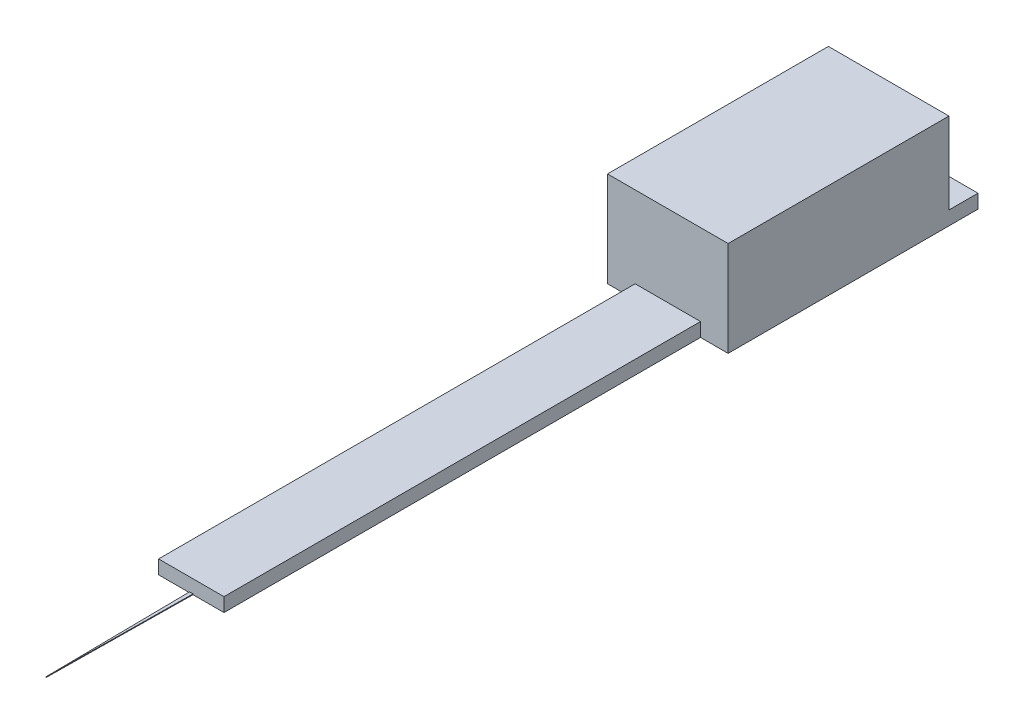
ISO-10303-21;
HEADER;
FILE_DESCRIPTION(('STEP AP214'),'2;1');
FILE_NAME('part.step','',(''),(''),'','','');
FILE_SCHEMA(('AUTOMOTIVE_DESIGN { 1 0 10303 214 1 1 1 1 }'));
ENDSEC;
DATA;
#1=APPLICATION_CONTEXT('core data for automotive mechanical design processes');
#2=APPLICATION_PROTOCOL_DEFINITION('international standard','automotive_design',2000,#1);
#3=PRODUCT_CONTEXT('',#1,'mechanical');
#4=PRODUCT('Part','Part','',(#3));
#5=PRODUCT_RELATED_PRODUCT_CATEGORY('part','',(#4));
#6=PRODUCT_DEFINITION_FORMATION('','',#4);
#7=PRODUCT_DEFINITION_CONTEXT('part definition',#1,'design');
#8=PRODUCT_DEFINITION('design','',#6,#7);
#9=PRODUCT_DEFINITION_SHAPE('','',#8);
#10=(LENGTH_UNIT() NAMED_UNIT(*) SI_UNIT(.MILLI.,.METRE.));
#11=(NAMED_UNIT(*) PLANE_ANGLE_UNIT() SI_UNIT($,.RADIAN.));
#12=(NAMED_UNIT(*) SI_UNIT($,.STERADIAN.) SOLID_ANGLE_UNIT());
#13=UNCERTAINTY_MEASURE_WITH_UNIT(LENGTH_MEASURE(1.E-05),#10,'distance_accuracy_value','');
#14=(GEOMETRIC_REPRESENTATION_CONTEXT(3) GLOBAL_UNCERTAINTY_ASSIGNED_CONTEXT((#13)) GLOBAL_UNIT_ASSIGNED_CONTEXT((#10,
#11,#12)) REPRESENTATION_CONTEXT('',''));
#15=CARTESIAN_POINT('',(0.,0.,0.));
#16=DIRECTION('',(0.,0.,1.));
#17=DIRECTION('',(1.,0.,0.));
#18=AXIS2_PLACEMENT_3D('',#15,#16,#17);
#19=CARTESIAN_POINT('',(-4.15,0.95,-60.));
#20=DIRECTION('',(0.,-1.,0.));
#21=DIRECTION('',(0.,0.,-1.));
#22=AXIS2_PLACEMENT_3D('',#19,#20,#21);
#23=PLANE('',#22);
#24=DIRECTION('',(1.,0.,0.));
#25=VECTOR('',#24,1.);
#26=CARTESIAN_POINT('',(4.15,0.95,-42.8));
#27=LINE('',#26,#25);
#28=CARTESIAN_POINT('',(-2.25,0.95,-42.8));
#29=VERTEX_POINT('',#28);
#30=CARTESIAN_POINT('',(2.25,0.95,-42.8));
#31=VERTEX_POINT('',#30);
#32=EDGE_CURVE('E11',#29,#31,#27,.T.);
#33=ORIENTED_EDGE('',*,*,#32,.F.);
#34=DIRECTION('',(0.,0.,1.));
#35=VECTOR('',#34,1.);
#36=CARTESIAN_POINT('',(-2.25,0.95,-10.));
#37=LINE('',#36,#35);
#38=CARTESIAN_POINT('',(-2.25,0.95,-10.));
#39=VERTEX_POINT('',#38);
#40=EDGE_CURVE('E163',#29,#39,#37,.T.);
#41=ORIENTED_EDGE('',*,*,#40,.T.);
#42=DIRECTION('',(1.,0.,0.));
#43=VECTOR('',#42,1.);
#44=CARTESIAN_POINT('',(2.25,0.95,-10.));
#45=LINE('',#44,#43);
#46=CARTESIAN_POINT('',(2.25,0.95,-10.));
#47=VERTEX_POINT('',#46);
#48=EDGE_CURVE('E185',#39,#47,#45,.T.);
#49=ORIENTED_EDGE('',*,*,#48,.T.);
#50=DIRECTION('',(0.,0.,-1.));
#51=VECTOR('',#50,1.);
#52=CARTESIAN_POINT('',(2.25,0.95,-42.8));
#53=LINE('',#52,#51);
#54=EDGE_CURVE('E252',#47,#31,#53,.T.);
#55=ORIENTED_EDGE('',*,*,#54,.T.);
#56=EDGE_LOOP('',(#33,#41,#49,#55));
#57=FACE_BOUND('',#56,.T.);
#58=ADVANCED_FACE('F31',(#57),#23,.F.);
#59=DIRECTION('',(-1.,0.,0.));
#60=VECTOR('',#59,1.);
#61=CARTESIAN_POINT('',(4.15,0.95,-58.));
#62=LINE('',#61,#60);
#63=CARTESIAN_POINT('',(4.15,0.95,-58.));
#64=VERTEX_POINT('',#63);
#65=CARTESIAN_POINT('',(-4.15,0.95,-58.));
#66=VERTEX_POINT('',#65);
#67=EDGE_CURVE('E48',#64,#66,#62,.T.);
#68=ORIENTED_EDGE('',*,*,#67,.F.);
#69=DIRECTION('',(0.,0.,-1.));
#70=VECTOR('',#69,1.);
#71=CARTESIAN_POINT('',(4.15,0.95,-60.));
#72=LINE('',#71,#70);
#73=CARTESIAN_POINT('',(4.15,0.95,-60.));
#74=VERTEX_POINT('',#73);
#75=EDGE_CURVE('E160',#64,#74,#72,.T.);
#76=ORIENTED_EDGE('',*,*,#75,.T.);
#77=DIRECTION('',(-1.,0.,0.));
#78=VECTOR('',#77,1.);
#79=CARTESIAN_POINT('',(-4.15,0.95,-60.));
#80=LINE('',#79,#78);
#81=CARTESIAN_POINT('',(-4.15,0.95,-60.));
#82=VERTEX_POINT('',#81);
#83=EDGE_CURVE('E247',#74,#82,#80,.T.);
#84=ORIENTED_EDGE('',*,*,#83,.T.);
#85=DIRECTION('',(0.,0.,1.));
#86=VECTOR('',#85,1.);
#87=CARTESIAN_POINT('',(-4.15,0.95,-42.8));
#88=LINE('',#87,#86);
#89=EDGE_CURVE('E161',#82,#66,#88,.T.);
#90=ORIENTED_EDGE('',*,*,#89,.T.);
#91=EDGE_LOOP('',(#68,#76,#84,#90));
#92=FACE_BOUND('',#91,.T.);
#93=ADVANCED_FACE('F291',(#92),#23,.F.);
#94=CARTESIAN_POINT('',(0.,0.05,0.));
#95=DIRECTION('',(0.999928007775067,0.,-0.0119991360933008));
#96=DIRECTION('',(-0.0119991360933008,0.,-0.999928007775067));
#97=AXIS2_PLACEMENT_3D('',#94,#95,#96);
#98=PLANE('',#97);
#99=DIRECTION('',(0.0119991360933008,0.,0.999928007775067));
#100=VECTOR('',#99,1.);
#101=CARTESIAN_POINT('',(0.,0.,0.));
#102=LINE('',#101,#100);
#103=CARTESIAN_POINT('',(-0.12,0.,-10.));
#104=VERTEX_POINT('',#103);
#105=CARTESIAN_POINT('',(0.,0.,0.));
#106=VERTEX_POINT('',#105);
#107=EDGE_CURVE('E244',#104,#106,#102,.T.);
#108=ORIENTED_EDGE('',*,*,#107,.T.);
#109=DIRECTION('',(0.,-1.,0.));
#110=VECTOR('',#109,1.);
#111=CARTESIAN_POINT('',(0.,0.05,0.));
#112=LINE('',#111,#110);
#113=CARTESIAN_POINT('',(0.,0.05,0.));
#114=VERTEX_POINT('',#113);
#115=EDGE_CURVE('E201',#114,#106,#112,.T.);
#116=ORIENTED_EDGE('',*,*,#115,.F.);
#117=DIRECTION('',(0.0119991360933008,0.,0.999928007775067));
#118=VECTOR('',#117,1.);
#119=CARTESIAN_POINT('',(0.,0.05,0.));
#120=LINE('',#119,#118);
#121=CARTESIAN_POINT('',(-0.12,0.05,-10.));
#122=VERTEX_POINT('',#121);
#123=EDGE_CURVE('E189',#122,#114,#120,.T.);
#124=ORIENTED_EDGE('',*,*,#123,.F.);
#125=DIRECTION('',(0.,-1.,0.));
#126=VECTOR('',#125,1.);
#127=CARTESIAN_POINT('',(-0.12,0.05,-10.));
#128=LINE('',#127,#126);
#129=EDGE_CURVE('E193',#122,#104,#128,.T.);
#130=ORIENTED_EDGE('',*,*,#129,.T.);
#131=EDGE_LOOP('',(#108,#116,#124,#130));
#132=FACE_BOUND('',#131,.T.);
#133=ADVANCED_FACE('F33',(#132),#98,.F.);
#134=CARTESIAN_POINT('',(0.,0.05,0.));
#135=DIRECTION('',(-0.999928007775067,0.,-0.0119991360933008));
#136=DIRECTION('',(-0.0119991360933008,0.,0.999928007775067));
#137=AXIS2_PLACEMENT_3D('',#134,#135,#136);
#138=PLANE('',#137);
#139=DIRECTION('',(0.0119991360933008,0.,-0.999928007775067));
#140=VECTOR('',#139,1.);
#141=CARTESIAN_POINT('',(0.,0.,0.));
#142=LINE('',#141,#140);
#143=CARTESIAN_POINT('',(0.12,0.,-10.));
#144=VERTEX_POINT('',#143);
#145=EDGE_CURVE('E242',#106,#144,#142,.T.);
#146=ORIENTED_EDGE('',*,*,#145,.T.);
#147=DIRECTION('',(0.,-1.,0.));
#148=VECTOR('',#147,1.);
#149=CARTESIAN_POINT('',(0.12,0.05,-10.));
#150=LINE('',#149,#148);
#151=CARTESIAN_POINT('',(0.12,0.05,-10.));
#152=VERTEX_POINT('',#151);
#153=EDGE_CURVE('E198',#152,#144,#150,.T.);
#154=ORIENTED_EDGE('',*,*,#153,.F.);
#155=DIRECTION('',(0.0119991360933008,0.,-0.999928007775067));
#156=VECTOR('',#155,1.);
#157=CARTESIAN_POINT('',(0.,0.05,0.));
#158=LINE('',#157,#156);
#159=EDGE_CURVE('E103',#114,#152,#158,.T.);
#160=ORIENTED_EDGE('',*,*,#159,.F.);
#161=ORIENTED_EDGE('',*,*,#115,.T.);
#162=EDGE_LOOP('',(#146,#154,#160,#161));
#163=FACE_BOUND('',#162,.T.);
#164=ADVANCED_FACE('F299',(#163),#138,.F.);
#165=CARTESIAN_POINT('',(2.25,0.05,-10.));
#166=DIRECTION('',(-1.,0.,0.));
#167=DIRECTION('',(0.,0.,1.));
#168=AXIS2_PLACEMENT_3D('',#165,#166,#167);
#169=PLANE('',#168);
#170=DIRECTION('',(0.,0.,-1.));
#171=VECTOR('',#170,1.);
#172=CARTESIAN_POINT('',(2.25,0.,-10.));
#173=LINE('',#172,#171);
#174=CARTESIAN_POINT('',(2.25,0.,-10.));
#175=VERTEX_POINT('',#174);
#176=CARTESIAN_POINT('',(2.25,0.,-42.8));
#177=VERTEX_POINT('',#176);
#178=EDGE_CURVE('E238',#175,#177,#173,.T.);
#179=ORIENTED_EDGE('',*,*,#178,.T.);
#180=DIRECTION('',(0.,-1.,0.));
#181=VECTOR('',#180,1.);
#182=CARTESIAN_POINT('',(2.25,0.05,-42.8));
#183=LINE('',#182,#181);
#184=EDGE_CURVE('E172',#31,#177,#183,.T.);
#185=ORIENTED_EDGE('',*,*,#184,.F.);
#186=ORIENTED_EDGE('',*,*,#54,.F.);
#187=DIRECTION('',(0.,-1.,0.));
#188=VECTOR('',#187,1.);
#189=CARTESIAN_POINT('',(2.25,0.05,-10.));
#190=LINE('',#189,#188);
#191=EDGE_CURVE('E202',#47,#175,#190,.T.);
#192=ORIENTED_EDGE('',*,*,#191,.T.);
#193=EDGE_LOOP('',(#179,#185,#186,#192));
#194=FACE_BOUND('',#193,.T.);
#195=ADVANCED_FACE('F274',(#194),#169,.F.);
#196=CARTESIAN_POINT('',(4.15,0.05,-42.8));
#197=DIRECTION('',(-1.,0.,0.));
#198=DIRECTION('',(0.,0.,1.));
#199=AXIS2_PLACEMENT_3D('',#196,#197,#198);
#200=PLANE('',#199);
#201=DIRECTION('',(0.,0.,-1.));
#202=VECTOR('',#201,1.);
#203=CARTESIAN_POINT('',(4.15,0.,-42.8));
#204=LINE('',#203,#202);
#205=CARTESIAN_POINT('',(4.15,0.,-42.8));
#206=VERTEX_POINT('',#205);
#207=CARTESIAN_POINT('',(4.15,0.,-60.));
#208=VERTEX_POINT('',#207);
#209=EDGE_CURVE('E234',#206,#208,#204,.T.);
#210=ORIENTED_EDGE('',*,*,#209,.T.);
#211=DIRECTION('',(0.,-1.,0.));
#212=VECTOR('',#211,1.);
#213=CARTESIAN_POINT('',(4.15,0.05,-60.));
#214=LINE('',#213,#212);
#215=EDGE_CURVE('E214',#74,#208,#214,.T.);
#216=ORIENTED_EDGE('',*,*,#215,.F.);
#217=ORIENTED_EDGE('',*,*,#75,.F.);
#218=DIRECTION('',(0.,-1.,0.));
#219=VECTOR('',#218,1.);
#220=CARTESIAN_POINT('',(4.15,6.55,-58.));
#221=LINE('',#220,#219);
#222=CARTESIAN_POINT('',(4.15,6.55,-58.));
#223=VERTEX_POINT('',#222);
#224=EDGE_CURVE('E141',#223,#64,#221,.T.);
#225=ORIENTED_EDGE('',*,*,#224,.F.);
#226=DIRECTION('',(0.,0.,-1.));
#227=VECTOR('',#226,1.);
#228=CARTESIAN_POINT('',(4.15,6.55,-58.));
#229=LINE('',#228,#227);
#230=CARTESIAN_POINT('',(4.15,6.55,-42.8));
#231=VERTEX_POINT('',#230);
#232=EDGE_CURVE('E148',#231,#223,#229,.T.);
#233=ORIENTED_EDGE('',*,*,#232,.F.);
#234=DIRECTION('',(0.,-1.,0.));
#235=VECTOR('',#234,1.);
#236=CARTESIAN_POINT('',(4.15,0.05,-42.8));
#237=LINE('',#236,#235);
#238=EDGE_CURVE('E212',#231,#206,#237,.T.);
#239=ORIENTED_EDGE('',*,*,#238,.T.);
#240=EDGE_LOOP('',(#210,#216,#217,#225,#233,#239));
#241=FACE_BOUND('',#240,.T.);
#242=ADVANCED_FACE('F158',(#241),#200,.F.);
#243=CARTESIAN_POINT('',(4.15,0.05,-60.));
#244=DIRECTION('',(0.,0.,1.));
#245=DIRECTION('',(1.,0.,0.));
#246=AXIS2_PLACEMENT_3D('',#243,#244,#245);
#247=PLANE('',#246);
#248=DIRECTION('',(-1.,0.,0.));
#249=VECTOR('',#248,1.);
#250=CARTESIAN_POINT('',(4.15,0.,-60.));
#251=LINE('',#250,#249);
#252=CARTESIAN_POINT('',(-4.15,0.,-60.));
#253=VERTEX_POINT('',#252);
#254=EDGE_CURVE('E232',#208,#253,#251,.T.);
#255=ORIENTED_EDGE('',*,*,#254,.T.);
#256=DIRECTION('',(0.,-1.,0.));
#257=VECTOR('',#256,1.);
#258=CARTESIAN_POINT('',(-4.15,0.05,-60.));
#259=LINE('',#258,#257);
#260=EDGE_CURVE('E217',#82,#253,#259,.T.);
#261=ORIENTED_EDGE('',*,*,#260,.F.);
#262=ORIENTED_EDGE('',*,*,#83,.F.);
#263=ORIENTED_EDGE('',*,*,#215,.T.);
#264=EDGE_LOOP('',(#255,#261,#262,#263));
#265=FACE_BOUND('',#264,.T.);
#266=ADVANCED_FACE('F285',(#265),#247,.F.);
#267=CARTESIAN_POINT('',(-4.15,0.05,-42.8));
#268=DIRECTION('',(1.,0.,0.));
#269=DIRECTION('',(0.,0.,-1.));
#270=AXIS2_PLACEMENT_3D('',#267,#268,#269);
#271=PLANE('',#270);
#272=DIRECTION('',(0.,0.,1.));
#273=VECTOR('',#272,1.);
#274=CARTESIAN_POINT('',(-4.15,0.,-42.8));
#275=LINE('',#274,#273);
#276=CARTESIAN_POINT('',(-4.15,0.,-42.8));
#277=VERTEX_POINT('',#276);
#278=EDGE_CURVE('E230',#253,#277,#275,.T.);
#279=ORIENTED_EDGE('',*,*,#278,.T.);
#280=DIRECTION('',(0.,-1.,0.));
#281=VECTOR('',#280,1.);
#282=CARTESIAN_POINT('',(-4.15,0.05,-42.8));
#283=LINE('',#282,#281);
#284=CARTESIAN_POINT('',(-4.15,6.55,-42.8));
#285=VERTEX_POINT('',#284);
#286=EDGE_CURVE('E220',#285,#277,#283,.T.);
#287=ORIENTED_EDGE('',*,*,#286,.F.);
#288=DIRECTION('',(0.,0.,1.));
#289=VECTOR('',#288,1.);
#290=CARTESIAN_POINT('',(-4.15,6.55,-58.));
#291=LINE('',#290,#289);
#292=CARTESIAN_POINT('',(-4.15,6.55,-58.));
#293=VERTEX_POINT('',#292);
#294=EDGE_CURVE('E147',#293,#285,#291,.T.);
#295=ORIENTED_EDGE('',*,*,#294,.F.);
#296=DIRECTION('',(0.,-1.,0.));
#297=VECTOR('',#296,1.);
#298=CARTESIAN_POINT('',(-4.15,6.55,-58.));
#299=LINE('',#298,#297);
#300=EDGE_CURVE('E143',#293,#66,#299,.T.);
#301=ORIENTED_EDGE('',*,*,#300,.T.);
#302=ORIENTED_EDGE('',*,*,#89,.F.);
#303=ORIENTED_EDGE('',*,*,#260,.T.);
#304=EDGE_LOOP('',(#279,#287,#295,#301,#302,#303));
#305=FACE_BOUND('',#304,.T.);
#306=ADVANCED_FACE('F290',(#305),#271,.F.);
#307=CARTESIAN_POINT('',(-2.25,0.05,-42.8));
#308=DIRECTION('',(0.,0.,-1.));
#309=DIRECTION('',(-1.,0.,0.));
#310=AXIS2_PLACEMENT_3D('',#307,#308,#309);
#311=PLANE('',#310);
#312=DIRECTION('',(1.,0.,0.));
#313=VECTOR('',#312,1.);
#314=CARTESIAN_POINT('',(-2.25,0.,-42.8));
#315=LINE('',#314,#313);
#316=CARTESIAN_POINT('',(-2.25,0.,-42.8));
#317=VERTEX_POINT('',#316);
#318=EDGE_CURVE('E228',#277,#317,#315,.T.);
#319=ORIENTED_EDGE('',*,*,#318,.T.);
#320=DIRECTION('',(0.,-1.,0.));
#321=VECTOR('',#320,1.);
#322=CARTESIAN_POINT('',(-2.25,0.05,-42.8));
#323=LINE('',#322,#321);
#324=EDGE_CURVE('E223',#29,#317,#323,.T.);
#325=ORIENTED_EDGE('',*,*,#324,.F.);
#326=ORIENTED_EDGE('',*,*,#32,.T.);
#327=ORIENTED_EDGE('',*,*,#184,.T.);
#328=DIRECTION('',(1.,0.,0.));
#329=VECTOR('',#328,1.);
#330=CARTESIAN_POINT('',(2.25,0.,-42.8));
#331=LINE('',#330,#329);
#332=EDGE_CURVE('E236',#177,#206,#331,.T.);
#333=ORIENTED_EDGE('',*,*,#332,.T.);
#334=ORIENTED_EDGE('',*,*,#238,.F.);
#335=DIRECTION('',(1.,0.,0.));
#336=VECTOR('',#335,1.);
#337=CARTESIAN_POINT('',(4.15,6.55,-42.8));
#338=LINE('',#337,#336);
#339=EDGE_CURVE('E154',#285,#231,#338,.T.);
#340=ORIENTED_EDGE('',*,*,#339,.F.);
#341=ORIENTED_EDGE('',*,*,#286,.T.);
#342=EDGE_LOOP('',(#319,#325,#326,#327,#333,#334,#340,#341));
#343=FACE_BOUND('',#342,.T.);
#344=ADVANCED_FACE('F283',(#343),#311,.F.);
#345=CARTESIAN_POINT('',(-2.25,0.05,-10.));
#346=DIRECTION('',(1.,0.,0.));
#347=DIRECTION('',(0.,0.,-1.));
#348=AXIS2_PLACEMENT_3D('',#345,#346,#347);
#349=PLANE('',#348);
#350=DIRECTION('',(0.,0.,1.));
#351=VECTOR('',#350,1.);
#352=CARTESIAN_POINT('',(-2.25,0.,-10.));
#353=LINE('',#352,#351);
#354=CARTESIAN_POINT('',(-2.25,0.,-10.));
#355=VERTEX_POINT('',#354);
#356=EDGE_CURVE('E226',#317,#355,#353,.T.);
#357=ORIENTED_EDGE('',*,*,#356,.T.);
#358=DIRECTION('',(0.,-1.,0.));
#359=VECTOR('',#358,1.);
#360=CARTESIAN_POINT('',(-2.25,0.05,-10.));
#361=LINE('',#360,#359);
#362=EDGE_CURVE('E195',#39,#355,#361,.T.);
#363=ORIENTED_EDGE('',*,*,#362,.F.);
#364=ORIENTED_EDGE('',*,*,#40,.F.);
#365=ORIENTED_EDGE('',*,*,#324,.T.);
#366=EDGE_LOOP('',(#357,#363,#364,#365));
#367=FACE_BOUND('',#366,.T.);
#368=ADVANCED_FACE('F311',(#367),#349,.F.);
#369=CARTESIAN_POINT('',(-0.12,0.05,-10.));
#370=DIRECTION('',(0.,0.,-1.));
#371=DIRECTION('',(-1.,0.,0.));
#372=AXIS2_PLACEMENT_3D('',#369,#370,#371);
#373=PLANE('',#372);
#374=DIRECTION('',(1.,0.,0.));
#375=VECTOR('',#374,1.);
#376=CARTESIAN_POINT('',(-0.12,0.,-10.));
#377=LINE('',#376,#375);
#378=EDGE_CURVE('E97',#355,#104,#377,.T.);
#379=ORIENTED_EDGE('',*,*,#378,.T.);
#380=ORIENTED_EDGE('',*,*,#129,.F.);
#381=DIRECTION('',(1.,0.,0.));
#382=VECTOR('',#381,1.);
#383=CARTESIAN_POINT('',(2.25,0.05,-10.));
#384=LINE('',#383,#382);
#385=EDGE_CURVE('E40',#122,#152,#384,.T.);
#386=ORIENTED_EDGE('',*,*,#385,.T.);
#387=ORIENTED_EDGE('',*,*,#153,.T.);
#388=DIRECTION('',(1.,0.,0.));
#389=VECTOR('',#388,1.);
#390=CARTESIAN_POINT('',(0.12,0.,-10.));
#391=LINE('',#390,#389);
#392=EDGE_CURVE('E240',#144,#175,#391,.T.);
#393=ORIENTED_EDGE('',*,*,#392,.T.);
#394=ORIENTED_EDGE('',*,*,#191,.F.);
#395=ORIENTED_EDGE('',*,*,#48,.F.);
#396=ORIENTED_EDGE('',*,*,#362,.T.);
#397=EDGE_LOOP('',(#379,#380,#386,#387,#393,#394,#395,#396));
#398=FACE_BOUND('',#397,.T.);
#399=ADVANCED_FACE('F270',(#398),#373,.F.);
#400=CARTESIAN_POINT('',(-0.12,0.05,-10.));
#401=DIRECTION('',(0.,1.,0.));
#402=DIRECTION('',(0.,0.,1.));
#403=AXIS2_PLACEMENT_3D('',#400,#401,#402);
#404=PLANE('',#403);
#405=ORIENTED_EDGE('',*,*,#385,.F.);
#406=ORIENTED_EDGE('',*,*,#123,.T.);
#407=ORIENTED_EDGE('',*,*,#159,.T.);
#408=EDGE_LOOP('',(#405,#406,#407));
#409=FACE_BOUND('',#408,.T.);
#410=ADVANCED_FACE('F304',(#409),#404,.T.);
#411=CARTESIAN_POINT('',(-0.12,0.,-10.));
#412=DIRECTION('',(0.,1.,0.));
#413=DIRECTION('',(0.,0.,1.));
#414=AXIS2_PLACEMENT_3D('',#411,#412,#413);
#415=PLANE('',#414);
#416=ORIENTED_EDGE('',*,*,#107,.F.);
#417=ORIENTED_EDGE('',*,*,#378,.F.);
#418=ORIENTED_EDGE('',*,*,#356,.F.);
#419=ORIENTED_EDGE('',*,*,#318,.F.);
#420=ORIENTED_EDGE('',*,*,#278,.F.);
#421=ORIENTED_EDGE('',*,*,#254,.F.);
#422=ORIENTED_EDGE('',*,*,#209,.F.);
#423=ORIENTED_EDGE('',*,*,#332,.F.);
#424=ORIENTED_EDGE('',*,*,#178,.F.);
#425=ORIENTED_EDGE('',*,*,#392,.F.);
#426=ORIENTED_EDGE('',*,*,#145,.F.);
#427=EDGE_LOOP('',(#416,#417,#418,#419,#420,#421,#422,#423,#424,#425,#426));
#428=FACE_BOUND('',#427,.T.);
#429=ADVANCED_FACE('F279',(#428),#415,.F.);
#430=CARTESIAN_POINT('',(4.15,6.55,-58.));
#431=DIRECTION('',(0.,0.,1.));
#432=DIRECTION('',(1.,0.,0.));
#433=AXIS2_PLACEMENT_3D('',#430,#431,#432);
#434=PLANE('',#433);
#435=ORIENTED_EDGE('',*,*,#67,.T.);
#436=ORIENTED_EDGE('',*,*,#300,.F.);
#437=DIRECTION('',(-1.,0.,0.));
#438=VECTOR('',#437,1.);
#439=CARTESIAN_POINT('',(4.15,6.55,-58.));
#440=LINE('',#439,#438);
#441=EDGE_CURVE('E137',#223,#293,#440,.T.);
#442=ORIENTED_EDGE('',*,*,#441,.F.);
#443=ORIENTED_EDGE('',*,*,#224,.T.);
#444=EDGE_LOOP('',(#435,#436,#442,#443));
#445=FACE_BOUND('',#444,.T.);
#446=ADVANCED_FACE('F139',(#445),#434,.F.);
#447=CARTESIAN_POINT('',(4.15,6.55,-42.8));
#448=DIRECTION('',(0.,-1.,0.));
#449=DIRECTION('',(0.,0.,-1.));
#450=AXIS2_PLACEMENT_3D('',#447,#448,#449);
#451=PLANE('',#450);
#452=ORIENTED_EDGE('',*,*,#232,.T.);
#453=ORIENTED_EDGE('',*,*,#441,.T.);
#454=ORIENTED_EDGE('',*,*,#294,.T.);
#455=ORIENTED_EDGE('',*,*,#339,.T.);
#456=EDGE_LOOP('',(#452,#453,#454,#455));
#457=FACE_BOUND('',#456,.T.);
#458=ADVANCED_FACE('F152',(#457),#451,.F.);
#459=CLOSED_SHELL('',(#58,#93,#133,#164,#195,#242,#266,#306,#344,#368,#399,#410,#429,#446,#458));
#460=MANIFOLD_SOLID_BREP('B2',#459);
#461=ADVANCED_BREP_SHAPE_REPRESENTATION('',(#18,#460),#14);
#462=SHAPE_DEFINITION_REPRESENTATION(#9,#461);
ENDSEC;
END-ISO-10303-21;
